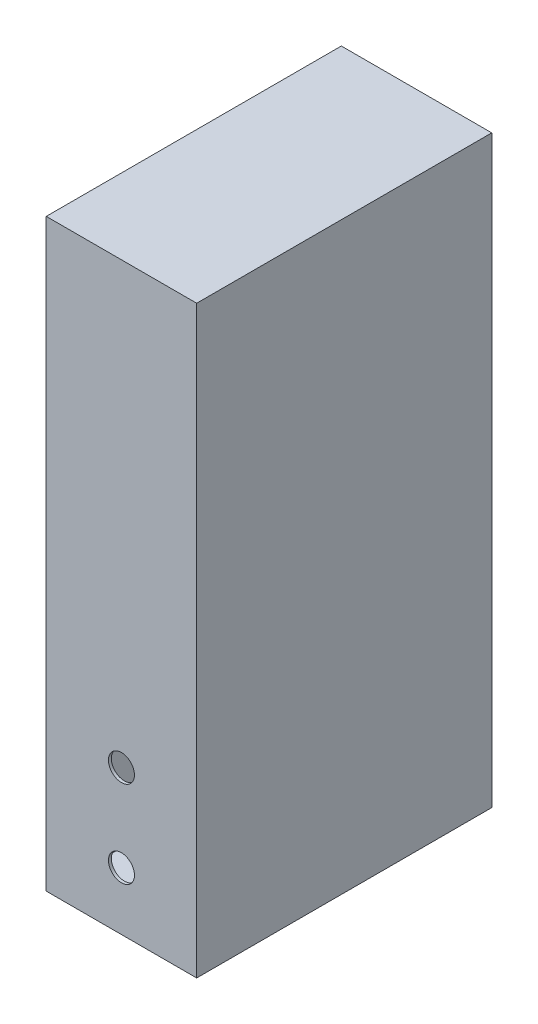
ISO-10303-21;
HEADER;
FILE_DESCRIPTION(('STEP AP214'),'2;1');
FILE_NAME('part.step','',(''),(''),'','','');
FILE_SCHEMA(('AUTOMOTIVE_DESIGN { 1 0 10303 214 1 1 1 1 }'));
ENDSEC;
DATA;
#1=APPLICATION_CONTEXT('core data for automotive mechanical design processes');
#2=APPLICATION_PROTOCOL_DEFINITION('international standard','automotive_design',2000,#1);
#3=PRODUCT_CONTEXT('',#1,'mechanical');
#4=PRODUCT('Part','Part','',(#3));
#5=PRODUCT_RELATED_PRODUCT_CATEGORY('part','',(#4));
#6=PRODUCT_DEFINITION_FORMATION('','',#4);
#7=PRODUCT_DEFINITION_CONTEXT('part definition',#1,'design');
#8=PRODUCT_DEFINITION('design','',#6,#7);
#9=PRODUCT_DEFINITION_SHAPE('','',#8);
#10=(LENGTH_UNIT() NAMED_UNIT(*) SI_UNIT(.MILLI.,.METRE.));
#11=(NAMED_UNIT(*) PLANE_ANGLE_UNIT() SI_UNIT($,.RADIAN.));
#12=(NAMED_UNIT(*) SI_UNIT($,.STERADIAN.) SOLID_ANGLE_UNIT());
#13=UNCERTAINTY_MEASURE_WITH_UNIT(LENGTH_MEASURE(1.E-05),#10,'distance_accuracy_value','');
#14=(GEOMETRIC_REPRESENTATION_CONTEXT(3) GLOBAL_UNCERTAINTY_ASSIGNED_CONTEXT((#13)) GLOBAL_UNIT_ASSIGNED_CONTEXT((#10,
#11,#12)) REPRESENTATION_CONTEXT('',''));
#15=CARTESIAN_POINT('',(0.,0.,0.));
#16=DIRECTION('',(0.,0.,1.));
#17=DIRECTION('',(1.,0.,0.));
#18=AXIS2_PLACEMENT_3D('',#15,#16,#17);
#19=CARTESIAN_POINT('',(0.,0.,102.));
#20=DIRECTION('',(0.,0.,-1.));
#21=DIRECTION('',(-1.,0.,0.));
#22=AXIS2_PLACEMENT_3D('',#19,#20,#21);
#23=PLANE('',#22);
#24=CARTESIAN_POINT('',(0.,-51.,102.));
#25=DIRECTION('',(0.,0.,1.));
#26=DIRECTION('',(1.,0.,0.));
#27=AXIS2_PLACEMENT_3D('',#24,#25,#26);
#28=CIRCLE('',#27,4.50000000000001);
#29=CARTESIAN_POINT('',(4.50000000000001,-51.,102.));
#30=VERTEX_POINT('',#29);
#31=EDGE_CURVE('E307',#30,#30,#28,.T.);
#32=ORIENTED_EDGE('',*,*,#31,.F.);
#33=EDGE_LOOP('',(#32));
#34=FACE_BOUND('',#33,.T.);
#35=CARTESIAN_POINT('',(0.,-81.,102.));
#36=DIRECTION('',(0.,0.,1.));
#37=DIRECTION('',(1.,0.,0.));
#38=AXIS2_PLACEMENT_3D('',#35,#36,#37);
#39=CIRCLE('',#38,4.5);
#40=CARTESIAN_POINT('',(4.5,-81.,102.));
#41=VERTEX_POINT('',#40);
#42=EDGE_CURVE('E309',#41,#41,#39,.T.);
#43=ORIENTED_EDGE('',*,*,#42,.F.);
#44=EDGE_LOOP('',(#43));
#45=FACE_BOUND('',#44,.T.);
#46=DIRECTION('',(0.,1.,0.));
#47=VECTOR('',#46,1.);
#48=CARTESIAN_POINT('',(26.,-101.,102.));
#49=LINE('',#48,#47);
#50=CARTESIAN_POINT('',(26.,-101.,102.));
#51=VERTEX_POINT('',#50);
#52=CARTESIAN_POINT('',(26.,101.,102.));
#53=VERTEX_POINT('',#52);
#54=EDGE_CURVE('E134',#51,#53,#49,.T.);
#55=ORIENTED_EDGE('',*,*,#54,.T.);
#56=DIRECTION('',(-1.,0.,0.));
#57=VECTOR('',#56,1.);
#58=CARTESIAN_POINT('',(-26.,101.,102.));
#59=LINE('',#58,#57);
#60=CARTESIAN_POINT('',(-26.,101.,102.));
#61=VERTEX_POINT('',#60);
#62=EDGE_CURVE('E137',#53,#61,#59,.T.);
#63=ORIENTED_EDGE('',*,*,#62,.T.);
#64=DIRECTION('',(0.,-1.,0.));
#65=VECTOR('',#64,1.);
#66=CARTESIAN_POINT('',(-26.,-101.,102.));
#67=LINE('',#66,#65);
#68=CARTESIAN_POINT('',(-26.,-101.,102.));
#69=VERTEX_POINT('',#68);
#70=EDGE_CURVE('E140',#61,#69,#67,.T.);
#71=ORIENTED_EDGE('',*,*,#70,.T.);
#72=DIRECTION('',(1.,0.,0.));
#73=VECTOR('',#72,1.);
#74=CARTESIAN_POINT('',(-26.,-101.,102.));
#75=LINE('',#74,#73);
#76=EDGE_CURVE('E142',#69,#51,#75,.T.);
#77=ORIENTED_EDGE('',*,*,#76,.T.);
#78=EDGE_LOOP('',(#55,#63,#71,#77));
#79=FACE_BOUND('',#78,.T.);
#80=ADVANCED_FACE('F33',(#34,#45,#79),#23,.F.);
#81=CARTESIAN_POINT('',(26.,-101.,102.));
#82=DIRECTION('',(-1.,0.,0.));
#83=DIRECTION('',(0.,0.,1.));
#84=AXIS2_PLACEMENT_3D('',#81,#82,#83);
#85=PLANE('',#84);
#86=DIRECTION('',(0.,1.,0.));
#87=VECTOR('',#86,1.);
#88=CARTESIAN_POINT('',(26.,-101.,0.));
#89=LINE('',#88,#87);
#90=CARTESIAN_POINT('',(26.,-101.,0.));
#91=VERTEX_POINT('',#90);
#92=CARTESIAN_POINT('',(26.,101.,0.));
#93=VERTEX_POINT('',#92);
#94=EDGE_CURVE('E126',#91,#93,#89,.T.);
#95=ORIENTED_EDGE('',*,*,#94,.T.);
#96=DIRECTION('',(0.,0.,-1.));
#97=VECTOR('',#96,1.);
#98=CARTESIAN_POINT('',(26.,101.,102.));
#99=LINE('',#98,#97);
#100=EDGE_CURVE('E11',#53,#93,#99,.T.);
#101=ORIENTED_EDGE('',*,*,#100,.F.);
#102=ORIENTED_EDGE('',*,*,#54,.F.);
#103=DIRECTION('',(0.,0.,-1.));
#104=VECTOR('',#103,1.);
#105=CARTESIAN_POINT('',(26.,-101.,102.));
#106=LINE('',#105,#104);
#107=EDGE_CURVE('E144',#51,#91,#106,.T.);
#108=ORIENTED_EDGE('',*,*,#107,.T.);
#109=EDGE_LOOP('',(#95,#101,#102,#108));
#110=FACE_BOUND('',#109,.T.);
#111=ADVANCED_FACE('F35',(#110),#85,.F.);
#112=CARTESIAN_POINT('',(-26.,101.,102.));
#113=DIRECTION('',(0.,-1.,0.));
#114=DIRECTION('',(0.,0.,-1.));
#115=AXIS2_PLACEMENT_3D('',#112,#113,#114);
#116=PLANE('',#115);
#117=DIRECTION('',(-1.,0.,0.));
#118=VECTOR('',#117,1.);
#119=CARTESIAN_POINT('',(-26.,101.,0.));
#120=LINE('',#119,#118);
#121=CARTESIAN_POINT('',(-26.,101.,0.));
#122=VERTEX_POINT('',#121);
#123=EDGE_CURVE('E147',#93,#122,#120,.T.);
#124=ORIENTED_EDGE('',*,*,#123,.T.);
#125=DIRECTION('',(0.,0.,-1.));
#126=VECTOR('',#125,1.);
#127=CARTESIAN_POINT('',(-26.,101.,102.));
#128=LINE('',#127,#126);
#129=EDGE_CURVE('E41',#61,#122,#128,.T.);
#130=ORIENTED_EDGE('',*,*,#129,.F.);
#131=ORIENTED_EDGE('',*,*,#62,.F.);
#132=ORIENTED_EDGE('',*,*,#100,.T.);
#133=EDGE_LOOP('',(#124,#130,#131,#132));
#134=FACE_BOUND('',#133,.T.);
#135=ADVANCED_FACE('F176',(#134),#116,.F.);
#136=CARTESIAN_POINT('',(-26.,-101.,102.));
#137=DIRECTION('',(1.,0.,0.));
#138=DIRECTION('',(0.,0.,-1.));
#139=AXIS2_PLACEMENT_3D('',#136,#137,#138);
#140=PLANE('',#139);
#141=DIRECTION('',(0.,-1.,0.));
#142=VECTOR('',#141,1.);
#143=CARTESIAN_POINT('',(-26.,-101.,0.));
#144=LINE('',#143,#142);
#145=CARTESIAN_POINT('',(-26.,-101.,0.));
#146=VERTEX_POINT('',#145);
#147=EDGE_CURVE('E149',#122,#146,#144,.T.);
#148=ORIENTED_EDGE('',*,*,#147,.T.);
#149=DIRECTION('',(0.,0.,-1.));
#150=VECTOR('',#149,1.);
#151=CARTESIAN_POINT('',(-26.,-101.,102.));
#152=LINE('',#151,#150);
#153=EDGE_CURVE('E154',#69,#146,#152,.T.);
#154=ORIENTED_EDGE('',*,*,#153,.F.);
#155=ORIENTED_EDGE('',*,*,#70,.F.);
#156=ORIENTED_EDGE('',*,*,#129,.T.);
#157=EDGE_LOOP('',(#148,#154,#155,#156));
#158=FACE_BOUND('',#157,.T.);
#159=ADVANCED_FACE('F161',(#158),#140,.F.);
#160=CARTESIAN_POINT('',(-26.,-101.,102.));
#161=DIRECTION('',(0.,1.,0.));
#162=DIRECTION('',(0.,0.,1.));
#163=AXIS2_PLACEMENT_3D('',#160,#161,#162);
#164=PLANE('',#163);
#165=DIRECTION('',(1.,0.,0.));
#166=VECTOR('',#165,1.);
#167=CARTESIAN_POINT('',(-26.,-101.,0.));
#168=LINE('',#167,#166);
#169=EDGE_CURVE('E138',#146,#91,#168,.T.);
#170=ORIENTED_EDGE('',*,*,#169,.T.);
#171=ORIENTED_EDGE('',*,*,#107,.F.);
#172=ORIENTED_EDGE('',*,*,#76,.F.);
#173=ORIENTED_EDGE('',*,*,#153,.T.);
#174=EDGE_LOOP('',(#170,#171,#172,#173));
#175=FACE_BOUND('',#174,.T.);
#176=ADVANCED_FACE('F170',(#175),#164,.F.);
#177=CARTESIAN_POINT('',(0.,0.,0.));
#178=DIRECTION('',(0.,0.,-1.));
#179=DIRECTION('',(-1.,0.,0.));
#180=AXIS2_PLACEMENT_3D('',#177,#178,#179);
#181=PLANE('',#180);
#182=ORIENTED_EDGE('',*,*,#94,.F.);
#183=ORIENTED_EDGE('',*,*,#169,.F.);
#184=ORIENTED_EDGE('',*,*,#147,.F.);
#185=ORIENTED_EDGE('',*,*,#123,.F.);
#186=EDGE_LOOP('',(#182,#183,#184,#185));
#187=FACE_BOUND('',#186,.T.);
#188=ADVANCED_FACE('F167',(#187),#181,.T.);
#189=CARTESIAN_POINT('',(0.,-81.,101.));
#190=DIRECTION('',(0.,0.,1.));
#191=DIRECTION('',(1.,0.,0.));
#192=AXIS2_PLACEMENT_3D('',#189,#190,#191);
#193=CYLINDRICAL_SURFACE('',#192,4.5);
#194=CARTESIAN_POINT('',(0.,-81.,101.));
#195=DIRECTION('',(0.,0.,1.));
#196=DIRECTION('',(1.,0.,0.));
#197=AXIS2_PLACEMENT_3D('',#194,#195,#196);
#198=CIRCLE('',#197,4.5);
#199=CARTESIAN_POINT('',(4.5,-81.,101.));
#200=VERTEX_POINT('',#199);
#201=EDGE_CURVE('E312',#200,#200,#198,.T.);
#202=ORIENTED_EDGE('',*,*,#201,.F.);
#203=EDGE_LOOP('',(#202));
#204=FACE_BOUND('',#203,.T.);
#205=ORIENTED_EDGE('',*,*,#42,.T.);
#206=EDGE_LOOP('',(#205));
#207=FACE_BOUND('',#206,.T.);
#208=ADVANCED_FACE('F196',(#204,#207),#193,.F.);
#209=CARTESIAN_POINT('',(0.,0.,101.));
#210=DIRECTION('',(0.,0.,-1.));
#211=DIRECTION('',(-1.,0.,0.));
#212=AXIS2_PLACEMENT_3D('',#209,#210,#211);
#213=PLANE('',#212);
#214=CARTESIAN_POINT('',(0.,-51.,101.));
#215=DIRECTION('',(0.,0.,1.));
#216=DIRECTION('',(1.,0.,0.));
#217=AXIS2_PLACEMENT_3D('',#214,#215,#216);
#218=CIRCLE('',#217,4.50000000000001);
#219=CARTESIAN_POINT('',(4.50000000000001,-51.,101.));
#220=VERTEX_POINT('',#219);
#221=EDGE_CURVE('E305',#220,#220,#218,.T.);
#222=ORIENTED_EDGE('',*,*,#221,.T.);
#223=EDGE_LOOP('',(#222));
#224=FACE_BOUND('',#223,.T.);
#225=ORIENTED_EDGE('',*,*,#201,.T.);
#226=EDGE_LOOP('',(#225));
#227=FACE_BOUND('',#226,.T.);
#228=DIRECTION('',(0.,1.,0.));
#229=VECTOR('',#228,1.);
#230=CARTESIAN_POINT('',(25.,-100.,101.));
#231=LINE('',#230,#229);
#232=CARTESIAN_POINT('',(25.,-100.,101.));
#233=VERTEX_POINT('',#232);
#234=CARTESIAN_POINT('',(25.,100.,101.));
#235=VERTEX_POINT('',#234);
#236=EDGE_CURVE('E48',#233,#235,#231,.T.);
#237=ORIENTED_EDGE('',*,*,#236,.F.);
#238=DIRECTION('',(1.,0.,0.));
#239=VECTOR('',#238,1.);
#240=CARTESIAN_POINT('',(-25.,-100.,101.));
#241=LINE('',#240,#239);
#242=CARTESIAN_POINT('',(-25.,-100.,101.));
#243=VERTEX_POINT('',#242);
#244=EDGE_CURVE('E102',#243,#233,#241,.T.);
#245=ORIENTED_EDGE('',*,*,#244,.F.);
#246=DIRECTION('',(0.,-1.,0.));
#247=VECTOR('',#246,1.);
#248=CARTESIAN_POINT('',(-25.,-100.,101.));
#249=LINE('',#248,#247);
#250=CARTESIAN_POINT('',(-25.,100.,101.));
#251=VERTEX_POINT('',#250);
#252=EDGE_CURVE('E112',#251,#243,#249,.T.);
#253=ORIENTED_EDGE('',*,*,#252,.F.);
#254=DIRECTION('',(-1.,0.,0.));
#255=VECTOR('',#254,1.);
#256=CARTESIAN_POINT('',(-25.,100.,101.));
#257=LINE('',#256,#255);
#258=EDGE_CURVE('E55',#235,#251,#257,.T.);
#259=ORIENTED_EDGE('',*,*,#258,.F.);
#260=EDGE_LOOP('',(#237,#245,#253,#259));
#261=FACE_BOUND('',#260,.T.);
#262=ADVANCED_FACE('F116',(#224,#227,#261),#213,.T.);
#263=CARTESIAN_POINT('',(0.,0.,1.));
#264=DIRECTION('',(0.,0.,-1.));
#265=DIRECTION('',(-1.,0.,0.));
#266=AXIS2_PLACEMENT_3D('',#263,#264,#265);
#267=PLANE('',#266);
#268=DIRECTION('',(0.,1.,0.));
#269=VECTOR('',#268,1.);
#270=CARTESIAN_POINT('',(25.,0.,1.));
#271=LINE('',#270,#269);
#272=CARTESIAN_POINT('',(25.,-100.,1.));
#273=VERTEX_POINT('',#272);
#274=CARTESIAN_POINT('',(25.,100.,1.));
#275=VERTEX_POINT('',#274);
#276=EDGE_CURVE('E117',#273,#275,#271,.T.);
#277=ORIENTED_EDGE('',*,*,#276,.T.);
#278=DIRECTION('',(-1.,0.,0.));
#279=VECTOR('',#278,1.);
#280=CARTESIAN_POINT('',(0.,100.,1.));
#281=LINE('',#280,#279);
#282=CARTESIAN_POINT('',(-25.,100.,1.));
#283=VERTEX_POINT('',#282);
#284=EDGE_CURVE('E120',#275,#283,#281,.T.);
#285=ORIENTED_EDGE('',*,*,#284,.T.);
#286=DIRECTION('',(0.,-1.,0.));
#287=VECTOR('',#286,1.);
#288=CARTESIAN_POINT('',(-25.,0.,1.));
#289=LINE('',#288,#287);
#290=CARTESIAN_POINT('',(-25.,-100.,1.));
#291=VERTEX_POINT('',#290);
#292=EDGE_CURVE('E130',#283,#291,#289,.T.);
#293=ORIENTED_EDGE('',*,*,#292,.T.);
#294=DIRECTION('',(1.,0.,0.));
#295=VECTOR('',#294,1.);
#296=CARTESIAN_POINT('',(0.,-100.,1.));
#297=LINE('',#296,#295);
#298=EDGE_CURVE('E104',#291,#273,#297,.T.);
#299=ORIENTED_EDGE('',*,*,#298,.T.);
#300=EDGE_LOOP('',(#277,#285,#293,#299));
#301=FACE_BOUND('',#300,.T.);
#302=ADVANCED_FACE('F192',(#301),#267,.F.);
#303=CARTESIAN_POINT('',(-26.,-100.,102.));
#304=DIRECTION('',(0.,1.,0.));
#305=DIRECTION('',(0.,0.,1.));
#306=AXIS2_PLACEMENT_3D('',#303,#304,#305);
#307=PLANE('',#306);
#308=ORIENTED_EDGE('',*,*,#244,.T.);
#309=DIRECTION('',(0.,0.,-1.));
#310=VECTOR('',#309,1.);
#311=CARTESIAN_POINT('',(25.,-100.,102.));
#312=LINE('',#311,#310);
#313=EDGE_CURVE('E109',#233,#273,#312,.T.);
#314=ORIENTED_EDGE('',*,*,#313,.T.);
#315=ORIENTED_EDGE('',*,*,#298,.F.);
#316=DIRECTION('',(0.,0.,-1.));
#317=VECTOR('',#316,1.);
#318=CARTESIAN_POINT('',(-25.,-100.,102.));
#319=LINE('',#318,#317);
#320=EDGE_CURVE('E98',#243,#291,#319,.T.);
#321=ORIENTED_EDGE('',*,*,#320,.F.);
#322=EDGE_LOOP('',(#308,#314,#315,#321));
#323=FACE_BOUND('',#322,.T.);
#324=ADVANCED_FACE('F100',(#323),#307,.T.);
#325=CARTESIAN_POINT('',(-25.,-101.,102.));
#326=DIRECTION('',(1.,0.,0.));
#327=DIRECTION('',(0.,0.,-1.));
#328=AXIS2_PLACEMENT_3D('',#325,#326,#327);
#329=PLANE('',#328);
#330=ORIENTED_EDGE('',*,*,#252,.T.);
#331=ORIENTED_EDGE('',*,*,#320,.T.);
#332=ORIENTED_EDGE('',*,*,#292,.F.);
#333=DIRECTION('',(0.,0.,-1.));
#334=VECTOR('',#333,1.);
#335=CARTESIAN_POINT('',(-25.,100.,102.));
#336=LINE('',#335,#334);
#337=EDGE_CURVE('E108',#251,#283,#336,.T.);
#338=ORIENTED_EDGE('',*,*,#337,.F.);
#339=EDGE_LOOP('',(#330,#331,#332,#338));
#340=FACE_BOUND('',#339,.T.);
#341=ADVANCED_FACE('F113',(#340),#329,.T.);
#342=CARTESIAN_POINT('',(-26.,100.,102.));
#343=DIRECTION('',(0.,-1.,0.));
#344=DIRECTION('',(0.,0.,-1.));
#345=AXIS2_PLACEMENT_3D('',#342,#343,#344);
#346=PLANE('',#345);
#347=ORIENTED_EDGE('',*,*,#258,.T.);
#348=ORIENTED_EDGE('',*,*,#337,.T.);
#349=ORIENTED_EDGE('',*,*,#284,.F.);
#350=DIRECTION('',(0.,0.,-1.));
#351=VECTOR('',#350,1.);
#352=CARTESIAN_POINT('',(25.,100.,102.));
#353=LINE('',#352,#351);
#354=EDGE_CURVE('E124',#235,#275,#353,.T.);
#355=ORIENTED_EDGE('',*,*,#354,.F.);
#356=EDGE_LOOP('',(#347,#348,#349,#355));
#357=FACE_BOUND('',#356,.T.);
#358=ADVANCED_FACE('F238',(#357),#346,.T.);
#359=CARTESIAN_POINT('',(25.,-101.,102.));
#360=DIRECTION('',(-1.,0.,0.));
#361=DIRECTION('',(0.,0.,1.));
#362=AXIS2_PLACEMENT_3D('',#359,#360,#361);
#363=PLANE('',#362);
#364=ORIENTED_EDGE('',*,*,#236,.T.);
#365=ORIENTED_EDGE('',*,*,#354,.T.);
#366=ORIENTED_EDGE('',*,*,#276,.F.);
#367=ORIENTED_EDGE('',*,*,#313,.F.);
#368=EDGE_LOOP('',(#364,#365,#366,#367));
#369=FACE_BOUND('',#368,.T.);
#370=ADVANCED_FACE('F245',(#369),#363,.T.);
#371=CARTESIAN_POINT('',(0.,-51.,101.));
#372=DIRECTION('',(0.,0.,1.));
#373=DIRECTION('',(1.,0.,0.));
#374=AXIS2_PLACEMENT_3D('',#371,#372,#373);
#375=CYLINDRICAL_SURFACE('',#374,4.50000000000001);
#376=ORIENTED_EDGE('',*,*,#221,.F.);
#377=EDGE_LOOP('',(#376));
#378=FACE_BOUND('',#377,.T.);
#379=ORIENTED_EDGE('',*,*,#31,.T.);
#380=EDGE_LOOP('',(#379));
#381=FACE_BOUND('',#380,.T.);
#382=ADVANCED_FACE('F252',(#378,#381),#375,.F.);
#383=CLOSED_SHELL('',(#80,#111,#135,#159,#176,#188,#208,#262,#302,#324,#341,#358,#370,#382));
#384=MANIFOLD_SOLID_BREP('B2',#383);
#385=ADVANCED_BREP_SHAPE_REPRESENTATION('',(#18,#384),#14);
#386=SHAPE_DEFINITION_REPRESENTATION(#9,#385);
ENDSEC;
END-ISO-10303-21;
